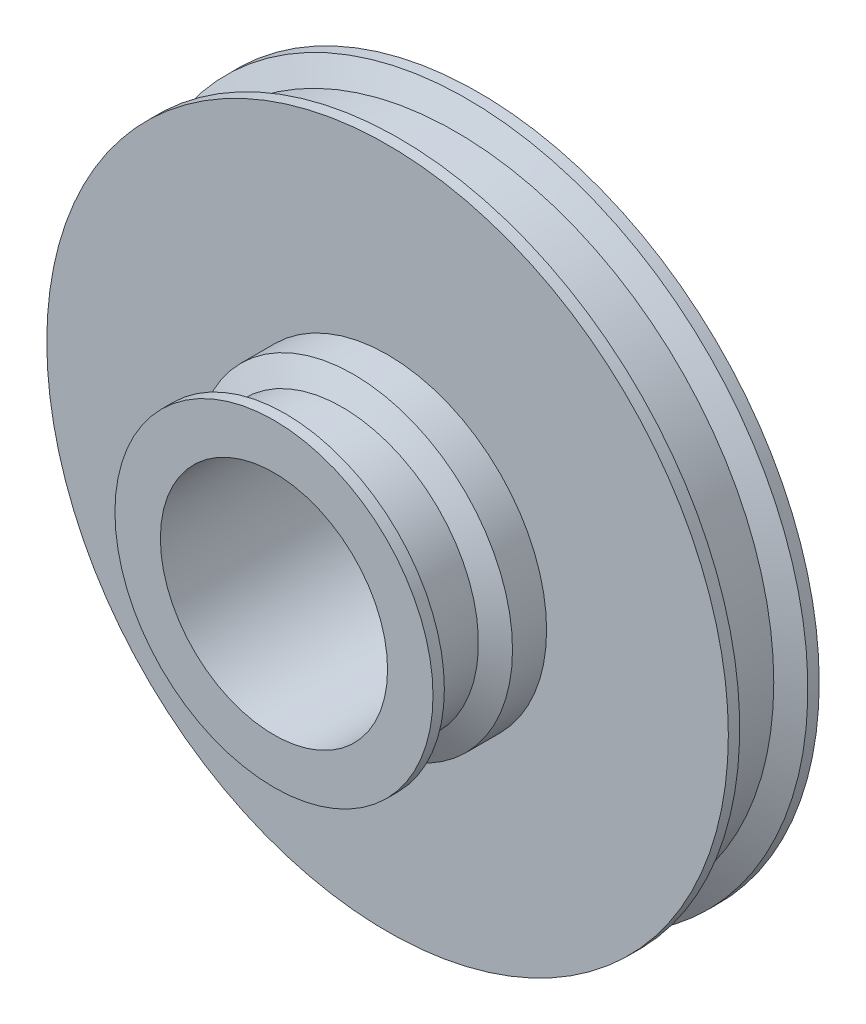
ISO-10303-21;
HEADER;
FILE_DESCRIPTION(('STEP AP214'),'2;1');
FILE_NAME('part.step','',(''),(''),'','','');
FILE_SCHEMA(('AUTOMOTIVE_DESIGN { 1 0 10303 214 1 1 1 1 }'));
ENDSEC;
DATA;
#1=APPLICATION_CONTEXT('core data for automotive mechanical design processes');
#2=APPLICATION_PROTOCOL_DEFINITION('international standard','automotive_design',2000,#1);
#3=PRODUCT_CONTEXT('',#1,'mechanical');
#4=PRODUCT('Part','Part','',(#3));
#5=PRODUCT_RELATED_PRODUCT_CATEGORY('part','',(#4));
#6=PRODUCT_DEFINITION_FORMATION('','',#4);
#7=PRODUCT_DEFINITION_CONTEXT('part definition',#1,'design');
#8=PRODUCT_DEFINITION('design','',#6,#7);
#9=PRODUCT_DEFINITION_SHAPE('','',#8);
#10=(LENGTH_UNIT() NAMED_UNIT(*) SI_UNIT(.MILLI.,.METRE.));
#11=(NAMED_UNIT(*) PLANE_ANGLE_UNIT() SI_UNIT($,.RADIAN.));
#12=(NAMED_UNIT(*) SI_UNIT($,.STERADIAN.) SOLID_ANGLE_UNIT());
#13=UNCERTAINTY_MEASURE_WITH_UNIT(LENGTH_MEASURE(1.E-05),#10,'distance_accuracy_value','');
#14=(GEOMETRIC_REPRESENTATION_CONTEXT(3) GLOBAL_UNCERTAINTY_ASSIGNED_CONTEXT((#13)) GLOBAL_UNIT_ASSIGNED_CONTEXT((#10,
#11,#12)) REPRESENTATION_CONTEXT('',''));
#15=CARTESIAN_POINT('',(0.,0.,0.));
#16=DIRECTION('',(0.,0.,1.));
#17=DIRECTION('',(1.,0.,0.));
#18=AXIS2_PLACEMENT_3D('',#15,#16,#17);
#19=CARTESIAN_POINT('',(80.4033279773208,45.6476090003614,4.));
#20=DIRECTION('',(0.,0.,-1.));
#21=DIRECTION('',(-1.,0.,0.));
#22=AXIS2_PLACEMENT_3D('',#19,#20,#21);
#23=CYLINDRICAL_SURFACE('',#22,15.);
#24=CARTESIAN_POINT('',(80.4033279773208,45.6476090003614,0.499999999999997));
#25=DIRECTION('',(0.,0.,-1.));
#26=DIRECTION('',(-1.,0.,0.));
#27=AXIS2_PLACEMENT_3D('',#24,#25,#26);
#28=CIRCLE('',#27,15.);
#29=CARTESIAN_POINT('',(65.4033279773208,45.6476090003614,0.499999999999997));
#30=VERTEX_POINT('',#29);
#31=EDGE_CURVE('E60',#30,#30,#28,.T.);
#32=ORIENTED_EDGE('',*,*,#31,.T.);
#33=EDGE_LOOP('',(#32));
#34=FACE_BOUND('',#33,.T.);
#35=CARTESIAN_POINT('',(80.4033279773208,45.6476090003614,0.));
#36=DIRECTION('',(0.,0.,1.));
#37=DIRECTION('',(1.,0.,0.));
#38=AXIS2_PLACEMENT_3D('',#35,#36,#37);
#39=CIRCLE('',#38,15.);
#40=CARTESIAN_POINT('',(95.4033279773208,45.6476090003614,0.));
#41=VERTEX_POINT('',#40);
#42=EDGE_CURVE('E40',#41,#41,#39,.T.);
#43=ORIENTED_EDGE('',*,*,#42,.T.);
#44=EDGE_LOOP('',(#43));
#45=FACE_BOUND('',#44,.T.);
#46=ADVANCED_FACE('F36',(#34,#45),#23,.T.);
#47=CARTESIAN_POINT('',(80.4033279773208,45.6476090003614,9.));
#48=DIRECTION('',(0.,0.,-1.));
#49=DIRECTION('',(-1.,0.,0.));
#50=AXIS2_PLACEMENT_3D('',#47,#48,#49);
#51=CYLINDRICAL_SURFACE('',#50,7.);
#52=CARTESIAN_POINT('',(80.4033279773208,45.6476090003614,8.5));
#53=DIRECTION('',(0.,0.,-1.));
#54=DIRECTION('',(-1.,0.,0.));
#55=AXIS2_PLACEMENT_3D('',#52,#53,#54);
#56=CIRCLE('',#55,7.);
#57=CARTESIAN_POINT('',(73.4033279773208,45.6476090003614,8.5));
#58=VERTEX_POINT('',#57);
#59=EDGE_CURVE('E61',#58,#58,#56,.T.);
#60=ORIENTED_EDGE('',*,*,#59,.F.);
#61=EDGE_LOOP('',(#60));
#62=FACE_BOUND('',#61,.T.);
#63=CARTESIAN_POINT('',(80.4033279773208,45.6476090003614,9.));
#64=DIRECTION('',(0.,0.,1.));
#65=DIRECTION('',(1.,0.,0.));
#66=AXIS2_PLACEMENT_3D('',#63,#64,#65);
#67=CIRCLE('',#66,7.);
#68=CARTESIAN_POINT('',(87.4033279773208,45.6476090003614,9.));
#69=VERTEX_POINT('',#68);
#70=EDGE_CURVE('E51',#69,#69,#67,.T.);
#71=ORIENTED_EDGE('',*,*,#70,.F.);
#72=EDGE_LOOP('',(#71));
#73=FACE_BOUND('',#72,.T.);
#74=ADVANCED_FACE('F100',(#62,#73),#51,.T.);
#75=CARTESIAN_POINT('',(80.4033279773208,45.6476090003614,0.));
#76=DIRECTION('',(0.,0.,1.));
#77=DIRECTION('',(1.,0.,0.));
#78=AXIS2_PLACEMENT_3D('',#75,#76,#77);
#79=PLANE('',#78);
#80=ORIENTED_EDGE('',*,*,#42,.F.);
#81=EDGE_LOOP('',(#80));
#82=FACE_BOUND('',#81,.T.);
#83=CARTESIAN_POINT('',(80.4033279773208,45.6476090003614,0.));
#84=DIRECTION('',(0.,0.,1.));
#85=DIRECTION('',(1.,0.,0.));
#86=AXIS2_PLACEMENT_3D('',#83,#84,#85);
#87=CIRCLE('',#86,5.);
#88=CARTESIAN_POINT('',(85.4033279773208,45.6476090003614,0.));
#89=VERTEX_POINT('',#88);
#90=EDGE_CURVE('E47',#89,#89,#87,.T.);
#91=ORIENTED_EDGE('',*,*,#90,.T.);
#92=EDGE_LOOP('',(#91));
#93=FACE_BOUND('',#92,.T.);
#94=ADVANCED_FACE('F105',(#82,#93),#79,.F.);
#95=CARTESIAN_POINT('',(80.4033279773208,45.6476090003614,4.));
#96=DIRECTION('',(0.,0.,-1.));
#97=DIRECTION('',(-1.,0.,0.));
#98=AXIS2_PLACEMENT_3D('',#95,#96,#97);
#99=CYLINDRICAL_SURFACE('',#98,5.);
#100=ORIENTED_EDGE('',*,*,#90,.F.);
#101=EDGE_LOOP('',(#100));
#102=FACE_BOUND('',#101,.T.);
#103=CARTESIAN_POINT('',(80.4033279773208,45.6476090003614,9.));
#104=DIRECTION('',(0.,0.,1.));
#105=DIRECTION('',(1.,0.,0.));
#106=AXIS2_PLACEMENT_3D('',#103,#104,#105);
#107=CIRCLE('',#106,5.);
#108=CARTESIAN_POINT('',(85.4033279773208,45.6476090003614,9.));
#109=VERTEX_POINT('',#108);
#110=EDGE_CURVE('E55',#109,#109,#107,.T.);
#111=ORIENTED_EDGE('',*,*,#110,.T.);
#112=EDGE_LOOP('',(#111));
#113=FACE_BOUND('',#112,.T.);
#114=ADVANCED_FACE('F114',(#102,#113),#99,.F.);
#115=CARTESIAN_POINT('',(80.4033279773208,45.6476090003614,9.));
#116=DIRECTION('',(0.,0.,1.));
#117=DIRECTION('',(1.,0.,0.));
#118=AXIS2_PLACEMENT_3D('',#115,#116,#117);
#119=PLANE('',#118);
#120=ORIENTED_EDGE('',*,*,#70,.T.);
#121=EDGE_LOOP('',(#120));
#122=FACE_BOUND('',#121,.T.);
#123=ORIENTED_EDGE('',*,*,#110,.F.);
#124=EDGE_LOOP('',(#123));
#125=FACE_BOUND('',#124,.T.);
#126=ADVANCED_FACE('F119',(#122,#125),#119,.T.);
#127=CARTESIAN_POINT('',(80.4033279773208,45.6476090003614,8.5));
#128=DIRECTION('',(0.,0.,1.));
#129=DIRECTION('',(1.,0.,0.));
#130=AXIS2_PLACEMENT_3D('',#127,#128,#129);
#131=CONICAL_SURFACE('',#130,7.,1.10714871779409);
#132=CARTESIAN_POINT('',(80.4033279773208,45.6476090003614,8.));
#133=DIRECTION('',(0.,0.,-1.));
#134=DIRECTION('',(-1.,0.,0.));
#135=AXIS2_PLACEMENT_3D('',#132,#133,#134);
#136=CIRCLE('',#135,6.);
#137=CARTESIAN_POINT('',(74.4033279773208,45.6476090003614,8.));
#138=VERTEX_POINT('',#137);
#139=EDGE_CURVE('E71',#138,#138,#136,.T.);
#140=ORIENTED_EDGE('',*,*,#139,.F.);
#141=EDGE_LOOP('',(#140));
#142=FACE_BOUND('',#141,.T.);
#143=ORIENTED_EDGE('',*,*,#59,.T.);
#144=EDGE_LOOP('',(#143));
#145=FACE_BOUND('',#144,.T.);
#146=ADVANCED_FACE('F124',(#142,#145),#131,.T.);
#147=CARTESIAN_POINT('',(80.4033279773208,45.6476090003614,6.));
#148=DIRECTION('',(0.,0.,-1.));
#149=DIRECTION('',(-1.,0.,0.));
#150=AXIS2_PLACEMENT_3D('',#147,#148,#149);
#151=CONICAL_SURFACE('',#150,6.,1.10714871779409);
#152=CARTESIAN_POINT('',(80.4033279773208,45.6476090003614,5.5));
#153=DIRECTION('',(0.,0.,-1.));
#154=DIRECTION('',(-1.,0.,0.));
#155=AXIS2_PLACEMENT_3D('',#152,#153,#154);
#156=CIRCLE('',#155,7.);
#157=CARTESIAN_POINT('',(73.4033279773208,45.6476090003614,5.5));
#158=VERTEX_POINT('',#157);
#159=EDGE_CURVE('E65',#158,#158,#156,.T.);
#160=ORIENTED_EDGE('',*,*,#159,.F.);
#161=EDGE_LOOP('',(#160));
#162=FACE_BOUND('',#161,.T.);
#163=CARTESIAN_POINT('',(80.4033279773208,45.6476090003614,6.));
#164=DIRECTION('',(0.,0.,-1.));
#165=DIRECTION('',(-1.,0.,0.));
#166=AXIS2_PLACEMENT_3D('',#163,#164,#165);
#167=CIRCLE('',#166,6.);
#168=CARTESIAN_POINT('',(74.4033279773208,45.6476090003614,6.));
#169=VERTEX_POINT('',#168);
#170=EDGE_CURVE('E68',#169,#169,#167,.T.);
#171=ORIENTED_EDGE('',*,*,#170,.T.);
#172=EDGE_LOOP('',(#171));
#173=FACE_BOUND('',#172,.T.);
#174=ADVANCED_FACE('F130',(#162,#173),#151,.T.);
#175=CARTESIAN_POINT('',(80.4033279773208,45.6476090003614,0.));
#176=DIRECTION('',(0.,0.,-1.));
#177=DIRECTION('',(-1.,0.,0.));
#178=AXIS2_PLACEMENT_3D('',#175,#176,#177);
#179=CYLINDRICAL_SURFACE('',#178,6.);
#180=ORIENTED_EDGE('',*,*,#170,.F.);
#181=EDGE_LOOP('',(#180));
#182=FACE_BOUND('',#181,.T.);
#183=ORIENTED_EDGE('',*,*,#139,.T.);
#184=EDGE_LOOP('',(#183));
#185=FACE_BOUND('',#184,.T.);
#186=ADVANCED_FACE('F145',(#182,#185),#179,.T.);
#187=CARTESIAN_POINT('',(80.4033279773208,45.6476090003614,0.999999999999996));
#188=DIRECTION('',(0.,0.,-1.));
#189=DIRECTION('',(-1.,0.,0.));
#190=AXIS2_PLACEMENT_3D('',#187,#188,#189);
#191=CONICAL_SURFACE('',#190,14.,1.10714871779409);
#192=ORIENTED_EDGE('',*,*,#31,.F.);
#193=EDGE_LOOP('',(#192));
#194=FACE_BOUND('',#193,.T.);
#195=CARTESIAN_POINT('',(80.4033279773208,45.6476090003614,0.999999999999996));
#196=DIRECTION('',(0.,0.,-1.));
#197=DIRECTION('',(-1.,0.,0.));
#198=AXIS2_PLACEMENT_3D('',#195,#196,#197);
#199=CIRCLE('',#198,14.);
#200=CARTESIAN_POINT('',(66.4033279773208,45.6476090003614,0.999999999999996));
#201=VERTEX_POINT('',#200);
#202=EDGE_CURVE('E76',#201,#201,#199,.T.);
#203=ORIENTED_EDGE('',*,*,#202,.T.);
#204=EDGE_LOOP('',(#203));
#205=FACE_BOUND('',#204,.T.);
#206=ADVANCED_FACE('F150',(#194,#205),#191,.T.);
#207=CARTESIAN_POINT('',(80.4033279773208,45.6476090003614,0.));
#208=DIRECTION('',(0.,0.,-1.));
#209=DIRECTION('',(-1.,0.,0.));
#210=AXIS2_PLACEMENT_3D('',#207,#208,#209);
#211=CYLINDRICAL_SURFACE('',#210,14.);
#212=ORIENTED_EDGE('',*,*,#202,.F.);
#213=EDGE_LOOP('',(#212));
#214=FACE_BOUND('',#213,.T.);
#215=CARTESIAN_POINT('',(80.4033279773208,45.6476090003614,3.));
#216=DIRECTION('',(0.,0.,-1.));
#217=DIRECTION('',(-1.,0.,0.));
#218=AXIS2_PLACEMENT_3D('',#215,#216,#217);
#219=CIRCLE('',#218,14.);
#220=CARTESIAN_POINT('',(66.4033279773208,45.6476090003614,3.));
#221=VERTEX_POINT('',#220);
#222=EDGE_CURVE('E79',#221,#221,#219,.T.);
#223=ORIENTED_EDGE('',*,*,#222,.T.);
#224=EDGE_LOOP('',(#223));
#225=FACE_BOUND('',#224,.T.);
#226=ADVANCED_FACE('F96',(#214,#225),#211,.T.);
#227=CARTESIAN_POINT('',(80.4033279773208,45.6476090003614,3.5));
#228=DIRECTION('',(0.,0.,1.));
#229=DIRECTION('',(1.,0.,0.));
#230=AXIS2_PLACEMENT_3D('',#227,#228,#229);
#231=CONICAL_SURFACE('',#230,15.,1.10714871779409);
#232=ORIENTED_EDGE('',*,*,#222,.F.);
#233=EDGE_LOOP('',(#232));
#234=FACE_BOUND('',#233,.T.);
#235=CARTESIAN_POINT('',(80.4033279773208,45.6476090003614,3.5));
#236=DIRECTION('',(0.,0.,-1.));
#237=DIRECTION('',(-1.,0.,0.));
#238=AXIS2_PLACEMENT_3D('',#235,#236,#237);
#239=CIRCLE('',#238,15.);
#240=CARTESIAN_POINT('',(65.4033279773208,45.6476090003614,3.5));
#241=VERTEX_POINT('',#240);
#242=EDGE_CURVE('E64',#241,#241,#239,.T.);
#243=ORIENTED_EDGE('',*,*,#242,.T.);
#244=EDGE_LOOP('',(#243));
#245=FACE_BOUND('',#244,.T.);
#246=ADVANCED_FACE('F85',(#234,#245),#231,.T.);
#247=ORIENTED_EDGE('',*,*,#242,.F.);
#248=EDGE_LOOP('',(#247));
#249=FACE_BOUND('',#248,.T.);
#250=CARTESIAN_POINT('',(80.4033279773208,45.6476090003614,4.));
#251=DIRECTION('',(0.,0.,1.));
#252=DIRECTION('',(1.,0.,0.));
#253=AXIS2_PLACEMENT_3D('',#250,#251,#252);
#254=CIRCLE('',#253,15.);
#255=CARTESIAN_POINT('',(95.4033279773208,45.6476090003614,4.));
#256=VERTEX_POINT('',#255);
#257=EDGE_CURVE('E10',#256,#256,#254,.T.);
#258=ORIENTED_EDGE('',*,*,#257,.F.);
#259=EDGE_LOOP('',(#258));
#260=FACE_BOUND('',#259,.T.);
#261=ADVANCED_FACE('F38',(#249,#260),#23,.T.);
#262=CARTESIAN_POINT('',(80.4033279773208,45.6476090003614,4.));
#263=DIRECTION('',(0.,0.,1.));
#264=DIRECTION('',(1.,0.,0.));
#265=AXIS2_PLACEMENT_3D('',#262,#263,#264);
#266=PLANE('',#265);
#267=ORIENTED_EDGE('',*,*,#257,.T.);
#268=EDGE_LOOP('',(#267));
#269=FACE_BOUND('',#268,.T.);
#270=CARTESIAN_POINT('',(80.4033279773208,45.6476090003614,4.));
#271=DIRECTION('',(0.,0.,1.));
#272=DIRECTION('',(1.,0.,0.));
#273=AXIS2_PLACEMENT_3D('',#270,#271,#272);
#274=CIRCLE('',#273,7.);
#275=CARTESIAN_POINT('',(87.4033279773208,45.6476090003614,4.));
#276=VERTEX_POINT('',#275);
#277=EDGE_CURVE('E52',#276,#276,#274,.T.);
#278=ORIENTED_EDGE('',*,*,#277,.F.);
#279=EDGE_LOOP('',(#278));
#280=FACE_BOUND('',#279,.T.);
#281=ADVANCED_FACE('F89',(#269,#280),#266,.T.);
#282=ORIENTED_EDGE('',*,*,#159,.T.);
#283=EDGE_LOOP('',(#282));
#284=FACE_BOUND('',#283,.T.);
#285=ORIENTED_EDGE('',*,*,#277,.T.);
#286=EDGE_LOOP('',(#285));
#287=FACE_BOUND('',#286,.T.);
#288=ADVANCED_FACE('F93',(#284,#287),#51,.T.);
#289=CLOSED_SHELL('',(#46,#74,#94,#114,#126,#146,#174,#186,#206,#226,#246,#261,#281,#288));
#290=MANIFOLD_SOLID_BREP('B2',#289);
#291=ADVANCED_BREP_SHAPE_REPRESENTATION('',(#18,#290),#14);
#292=SHAPE_DEFINITION_REPRESENTATION(#9,#291);
ENDSEC;
END-ISO-10303-21;
